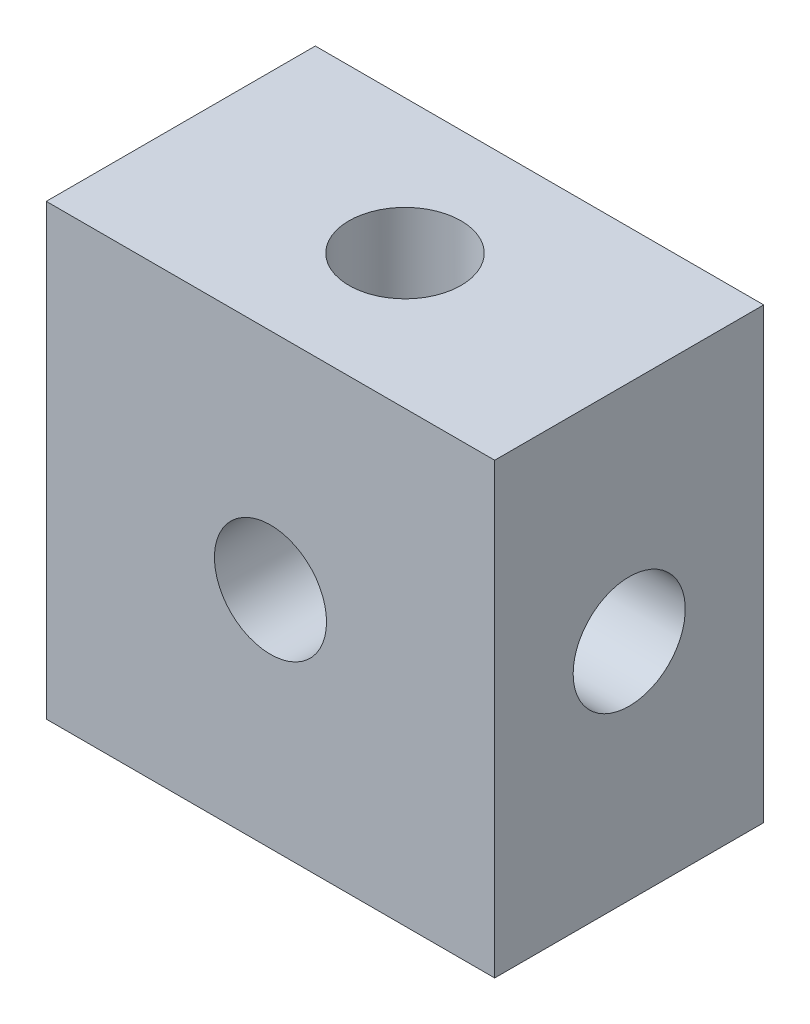
ISO-10303-21;
HEADER;
FILE_DESCRIPTION(('STEP AP214'),'2;1');
FILE_NAME('part.step','',(''),(''),'','','');
FILE_SCHEMA(('AUTOMOTIVE_DESIGN { 1 0 10303 214 1 1 1 1 }'));
ENDSEC;
DATA;
#1=APPLICATION_CONTEXT('core data for automotive mechanical design processes');
#2=APPLICATION_PROTOCOL_DEFINITION('international standard','automotive_design',2000,#1);
#3=PRODUCT_CONTEXT('',#1,'mechanical');
#4=PRODUCT('Part','Part','',(#3));
#5=PRODUCT_RELATED_PRODUCT_CATEGORY('part','',(#4));
#6=PRODUCT_DEFINITION_FORMATION('','',#4);
#7=PRODUCT_DEFINITION_CONTEXT('part definition',#1,'design');
#8=PRODUCT_DEFINITION('design','',#6,#7);
#9=PRODUCT_DEFINITION_SHAPE('','',#8);
#10=(LENGTH_UNIT() NAMED_UNIT(*) SI_UNIT(.MILLI.,.METRE.));
#11=(NAMED_UNIT(*) PLANE_ANGLE_UNIT() SI_UNIT($,.RADIAN.));
#12=(NAMED_UNIT(*) SI_UNIT($,.STERADIAN.) SOLID_ANGLE_UNIT());
#13=UNCERTAINTY_MEASURE_WITH_UNIT(LENGTH_MEASURE(1.E-05),#10,'distance_accuracy_value','');
#14=(GEOMETRIC_REPRESENTATION_CONTEXT(3) GLOBAL_UNCERTAINTY_ASSIGNED_CONTEXT((#13)) GLOBAL_UNIT_ASSIGNED_CONTEXT((#10,
#11,#12)) REPRESENTATION_CONTEXT('',''));
#15=CARTESIAN_POINT('',(0.,0.,0.));
#16=DIRECTION('',(0.,0.,1.));
#17=DIRECTION('',(1.,0.,0.));
#18=AXIS2_PLACEMENT_3D('',#15,#16,#17);
#19=CARTESIAN_POINT('',(-5.,0.,0.));
#20=DIRECTION('',(-1.,0.,0.));
#21=DIRECTION('',(0.,0.,1.));
#22=AXIS2_PLACEMENT_3D('',#19,#20,#21);
#23=CYLINDRICAL_SURFACE('',#22,1.24999999999999);
#24=CARTESIAN_POINT('',(-5.,0.,0.));
#25=DIRECTION('',(-1.,0.,0.));
#26=DIRECTION('',(0.,0.,1.));
#27=AXIS2_PLACEMENT_3D('',#24,#25,#26);
#28=CIRCLE('',#27,1.24999999999999);
#29=CARTESIAN_POINT('',(-5.,0.,1.24999999999999));
#30=VERTEX_POINT('',#29);
#31=EDGE_CURVE('E143',#30,#30,#28,.T.);
#32=ORIENTED_EDGE('',*,*,#31,.T.);
#33=EDGE_LOOP('',(#32));
#34=FACE_BOUND('',#33,.T.);
#35=CARTESIAN_POINT('',(0.,0.,0.));
#36=DIRECTION('',(-0.707106781186547,0.,0.707106781186547));
#37=DIRECTION('',(-0.707106781186547,0.,-0.707106781186547));
#38=AXIS2_PLACEMENT_3D('',#35,#36,#37);
#39=ELLIPSE('',#38,1.76776695296636,1.24999999999999);
#40=CARTESIAN_POINT('',(-0.883883476483179,-0.883883476483179,-0.883883476483179));
#41=VERTEX_POINT('',#40);
#42=CARTESIAN_POINT('',(-0.883883476483179,0.883883476483179,-0.883883476483179));
#43=VERTEX_POINT('',#42);
#44=EDGE_CURVE('E104',#41,#43,#39,.F.);
#45=ORIENTED_EDGE('',*,*,#44,.T.);
#46=CARTESIAN_POINT('',(0.,0.,0.));
#47=DIRECTION('',(-0.707106781186547,-0.707106781186547,0.));
#48=DIRECTION('',(-0.707106781186547,0.707106781186547,0.));
#49=AXIS2_PLACEMENT_3D('',#46,#47,#48);
#50=ELLIPSE('',#49,1.76776695296636,1.24999999999999);
#51=CARTESIAN_POINT('',(-0.883883476483179,0.883883476483179,0.883883476483179));
#52=VERTEX_POINT('',#51);
#53=EDGE_CURVE('E50',#43,#52,#50,.F.);
#54=ORIENTED_EDGE('',*,*,#53,.T.);
#55=CARTESIAN_POINT('',(0.,0.,0.));
#56=DIRECTION('',(-0.707106781186547,0.,-0.707106781186547));
#57=DIRECTION('',(-0.707106781186547,0.,0.707106781186547));
#58=AXIS2_PLACEMENT_3D('',#55,#56,#57);
#59=ELLIPSE('',#58,1.76776695296636,1.24999999999999);
#60=CARTESIAN_POINT('',(-0.883883476483179,-0.883883476483179,0.883883476483179));
#61=VERTEX_POINT('',#60);
#62=EDGE_CURVE('E117',#52,#61,#59,.F.);
#63=ORIENTED_EDGE('',*,*,#62,.T.);
#64=CARTESIAN_POINT('',(0.,0.,0.));
#65=DIRECTION('',(-0.707106781186547,0.707106781186547,0.));
#66=DIRECTION('',(-0.707106781186547,-0.707106781186547,0.));
#67=AXIS2_PLACEMENT_3D('',#64,#65,#66);
#68=ELLIPSE('',#67,1.76776695296636,1.24999999999999);
#69=EDGE_CURVE('E128',#61,#41,#68,.F.);
#70=ORIENTED_EDGE('',*,*,#69,.T.);
#71=EDGE_LOOP('',(#45,#54,#63,#70));
#72=FACE_BOUND('',#71,.T.);
#73=ADVANCED_FACE('F35',(#34,#72),#23,.F.);
#74=CARTESIAN_POINT('',(5.,-5.,3.));
#75=DIRECTION('',(-1.,0.,0.));
#76=DIRECTION('',(0.,0.,1.));
#77=AXIS2_PLACEMENT_3D('',#74,#75,#76);
#78=PLANE('',#77);
#79=CARTESIAN_POINT('',(5.,0.,0.));
#80=DIRECTION('',(-1.,0.,0.));
#81=DIRECTION('',(0.,0.,1.));
#82=AXIS2_PLACEMENT_3D('',#79,#80,#81);
#83=CIRCLE('',#82,1.25);
#84=CARTESIAN_POINT('',(5.,0.,1.25));
#85=VERTEX_POINT('',#84);
#86=EDGE_CURVE('E146',#85,#85,#83,.T.);
#87=ORIENTED_EDGE('',*,*,#86,.T.);
#88=EDGE_LOOP('',(#87));
#89=FACE_BOUND('',#88,.T.);
#90=DIRECTION('',(0.,1.,0.));
#91=VECTOR('',#90,1.);
#92=CARTESIAN_POINT('',(5.,-5.,-3.));
#93=LINE('',#92,#91);
#94=CARTESIAN_POINT('',(5.,-5.,-3.));
#95=VERTEX_POINT('',#94);
#96=CARTESIAN_POINT('',(5.,5.,-3.));
#97=VERTEX_POINT('',#96);
#98=EDGE_CURVE('E149',#95,#97,#93,.T.);
#99=ORIENTED_EDGE('',*,*,#98,.T.);
#100=DIRECTION('',(0.,0.,-1.));
#101=VECTOR('',#100,1.);
#102=CARTESIAN_POINT('',(5.,5.,3.));
#103=LINE('',#102,#101);
#104=CARTESIAN_POINT('',(5.,5.,3.));
#105=VERTEX_POINT('',#104);
#106=EDGE_CURVE('E121',#105,#97,#103,.T.);
#107=ORIENTED_EDGE('',*,*,#106,.F.);
#108=DIRECTION('',(0.,1.,0.));
#109=VECTOR('',#108,1.);
#110=CARTESIAN_POINT('',(5.,-5.,3.));
#111=LINE('',#110,#109);
#112=CARTESIAN_POINT('',(5.,-5.,3.));
#113=VERTEX_POINT('',#112);
#114=EDGE_CURVE('E150',#113,#105,#111,.T.);
#115=ORIENTED_EDGE('',*,*,#114,.F.);
#116=DIRECTION('',(0.,0.,-1.));
#117=VECTOR('',#116,1.);
#118=CARTESIAN_POINT('',(5.,-5.,3.));
#119=LINE('',#118,#117);
#120=EDGE_CURVE('E160',#113,#95,#119,.T.);
#121=ORIENTED_EDGE('',*,*,#120,.T.);
#122=EDGE_LOOP('',(#99,#107,#115,#121));
#123=FACE_BOUND('',#122,.T.);
#124=ADVANCED_FACE('F37',(#89,#123),#78,.F.);
#125=CARTESIAN_POINT('',(-5.,5.,3.));
#126=DIRECTION('',(0.,-1.,0.));
#127=DIRECTION('',(0.,0.,-1.));
#128=AXIS2_PLACEMENT_3D('',#125,#126,#127);
#129=PLANE('',#128);
#130=CARTESIAN_POINT('',(0.,5.,0.));
#131=DIRECTION('',(0.,-1.,0.));
#132=DIRECTION('',(0.,0.,-1.));
#133=AXIS2_PLACEMENT_3D('',#130,#131,#132);
#134=CIRCLE('',#133,1.25);
#135=CARTESIAN_POINT('',(0.,5.,-1.25));
#136=VERTEX_POINT('',#135);
#137=EDGE_CURVE('E114',#136,#136,#134,.T.);
#138=ORIENTED_EDGE('',*,*,#137,.T.);
#139=EDGE_LOOP('',(#138));
#140=FACE_BOUND('',#139,.T.);
#141=DIRECTION('',(-1.,0.,0.));
#142=VECTOR('',#141,1.);
#143=CARTESIAN_POINT('',(-5.,5.,-3.));
#144=LINE('',#143,#142);
#145=CARTESIAN_POINT('',(-5.,5.,-3.));
#146=VERTEX_POINT('',#145);
#147=EDGE_CURVE('E163',#97,#146,#144,.T.);
#148=ORIENTED_EDGE('',*,*,#147,.T.);
#149=DIRECTION('',(0.,0.,-1.));
#150=VECTOR('',#149,1.);
#151=CARTESIAN_POINT('',(-5.,5.,3.));
#152=LINE('',#151,#150);
#153=CARTESIAN_POINT('',(-5.,5.,3.));
#154=VERTEX_POINT('',#153);
#155=EDGE_CURVE('E173',#154,#146,#152,.T.);
#156=ORIENTED_EDGE('',*,*,#155,.F.);
#157=DIRECTION('',(-1.,0.,0.));
#158=VECTOR('',#157,1.);
#159=CARTESIAN_POINT('',(-5.,5.,3.));
#160=LINE('',#159,#158);
#161=EDGE_CURVE('E153',#105,#154,#160,.T.);
#162=ORIENTED_EDGE('',*,*,#161,.F.);
#163=ORIENTED_EDGE('',*,*,#106,.T.);
#164=EDGE_LOOP('',(#148,#156,#162,#163));
#165=FACE_BOUND('',#164,.T.);
#166=ADVANCED_FACE('F178',(#140,#165),#129,.F.);
#167=CARTESIAN_POINT('',(-5.,-5.,3.));
#168=DIRECTION('',(1.,0.,0.));
#169=DIRECTION('',(0.,0.,-1.));
#170=AXIS2_PLACEMENT_3D('',#167,#168,#169);
#171=PLANE('',#170);
#172=ORIENTED_EDGE('',*,*,#31,.F.);
#173=EDGE_LOOP('',(#172));
#174=FACE_BOUND('',#173,.T.);
#175=DIRECTION('',(0.,-1.,0.));
#176=VECTOR('',#175,1.);
#177=CARTESIAN_POINT('',(-5.,-5.,-3.));
#178=LINE('',#177,#176);
#179=CARTESIAN_POINT('',(-5.,-5.,-3.));
#180=VERTEX_POINT('',#179);
#181=EDGE_CURVE('E165',#146,#180,#178,.T.);
#182=ORIENTED_EDGE('',*,*,#181,.T.);
#183=DIRECTION('',(0.,0.,-1.));
#184=VECTOR('',#183,1.);
#185=CARTESIAN_POINT('',(-5.,-5.,3.));
#186=LINE('',#185,#184);
#187=CARTESIAN_POINT('',(-5.,-5.,3.));
#188=VERTEX_POINT('',#187);
#189=EDGE_CURVE('E170',#188,#180,#186,.T.);
#190=ORIENTED_EDGE('',*,*,#189,.F.);
#191=DIRECTION('',(0.,-1.,0.));
#192=VECTOR('',#191,1.);
#193=CARTESIAN_POINT('',(-5.,-5.,3.));
#194=LINE('',#193,#192);
#195=EDGE_CURVE('E156',#154,#188,#194,.T.);
#196=ORIENTED_EDGE('',*,*,#195,.F.);
#197=ORIENTED_EDGE('',*,*,#155,.T.);
#198=EDGE_LOOP('',(#182,#190,#196,#197));
#199=FACE_BOUND('',#198,.T.);
#200=ADVANCED_FACE('F190',(#174,#199),#171,.F.);
#201=CARTESIAN_POINT('',(-5.,-5.,3.));
#202=DIRECTION('',(0.,1.,0.));
#203=DIRECTION('',(0.,0.,1.));
#204=AXIS2_PLACEMENT_3D('',#201,#202,#203);
#205=PLANE('',#204);
#206=CARTESIAN_POINT('',(0.,-5.,0.));
#207=DIRECTION('',(0.,-1.,0.));
#208=DIRECTION('',(0.,0.,-1.));
#209=AXIS2_PLACEMENT_3D('',#206,#207,#208);
#210=CIRCLE('',#209,1.24999999999999);
#211=CARTESIAN_POINT('',(0.,-5.,-1.24999999999999));
#212=VERTEX_POINT('',#211);
#213=EDGE_CURVE('E238',#212,#212,#210,.T.);
#214=ORIENTED_EDGE('',*,*,#213,.F.);
#215=EDGE_LOOP('',(#214));
#216=FACE_BOUND('',#215,.T.);
#217=DIRECTION('',(1.,0.,0.));
#218=VECTOR('',#217,1.);
#219=CARTESIAN_POINT('',(-5.,-5.,-3.));
#220=LINE('',#219,#218);
#221=EDGE_CURVE('E154',#180,#95,#220,.T.);
#222=ORIENTED_EDGE('',*,*,#221,.T.);
#223=ORIENTED_EDGE('',*,*,#120,.F.);
#224=DIRECTION('',(1.,0.,0.));
#225=VECTOR('',#224,1.);
#226=CARTESIAN_POINT('',(-5.,-5.,3.));
#227=LINE('',#226,#225);
#228=EDGE_CURVE('E158',#188,#113,#227,.T.);
#229=ORIENTED_EDGE('',*,*,#228,.F.);
#230=ORIENTED_EDGE('',*,*,#189,.T.);
#231=EDGE_LOOP('',(#222,#223,#229,#230));
#232=FACE_BOUND('',#231,.T.);
#233=ADVANCED_FACE('F194',(#216,#232),#205,.F.);
#234=CARTESIAN_POINT('',(0.,0.,3.));
#235=DIRECTION('',(0.,0.,-1.));
#236=DIRECTION('',(-1.,0.,0.));
#237=AXIS2_PLACEMENT_3D('',#234,#235,#236);
#238=PLANE('',#237);
#239=CARTESIAN_POINT('',(0.,0.,3.));
#240=DIRECTION('',(0.,0.,1.));
#241=DIRECTION('',(1.,0.,0.));
#242=AXIS2_PLACEMENT_3D('',#239,#240,#241);
#243=CIRCLE('',#242,1.24999999999999);
#244=CARTESIAN_POINT('',(1.24999999999999,0.,3.));
#245=VERTEX_POINT('',#244);
#246=EDGE_CURVE('E137',#245,#245,#243,.T.);
#247=ORIENTED_EDGE('',*,*,#246,.F.);
#248=EDGE_LOOP('',(#247));
#249=FACE_BOUND('',#248,.T.);
#250=ORIENTED_EDGE('',*,*,#114,.T.);
#251=ORIENTED_EDGE('',*,*,#161,.T.);
#252=ORIENTED_EDGE('',*,*,#195,.T.);
#253=ORIENTED_EDGE('',*,*,#228,.T.);
#254=EDGE_LOOP('',(#250,#251,#252,#253));
#255=FACE_BOUND('',#254,.T.);
#256=ADVANCED_FACE('F196',(#249,#255),#238,.F.);
#257=CARTESIAN_POINT('',(0.,0.,-3.));
#258=DIRECTION('',(0.,0.,-1.));
#259=DIRECTION('',(-1.,0.,0.));
#260=AXIS2_PLACEMENT_3D('',#257,#258,#259);
#261=PLANE('',#260);
#262=CARTESIAN_POINT('',(0.,0.,-3.));
#263=DIRECTION('',(0.,0.,1.));
#264=DIRECTION('',(1.,0.,0.));
#265=AXIS2_PLACEMENT_3D('',#262,#263,#264);
#266=CIRCLE('',#265,1.25);
#267=CARTESIAN_POINT('',(1.25,0.,-3.));
#268=VERTEX_POINT('',#267);
#269=EDGE_CURVE('E140',#268,#268,#266,.T.);
#270=ORIENTED_EDGE('',*,*,#269,.T.);
#271=EDGE_LOOP('',(#270));
#272=FACE_BOUND('',#271,.T.);
#273=ORIENTED_EDGE('',*,*,#98,.F.);
#274=ORIENTED_EDGE('',*,*,#221,.F.);
#275=ORIENTED_EDGE('',*,*,#181,.F.);
#276=ORIENTED_EDGE('',*,*,#147,.F.);
#277=EDGE_LOOP('',(#273,#274,#275,#276));
#278=FACE_BOUND('',#277,.T.);
#279=ADVANCED_FACE('F186',(#272,#278),#261,.T.);
#280=CARTESIAN_POINT('',(0.,0.,0.));
#281=DIRECTION('',(-0.707106781186547,0.,-0.707106781186547));
#282=DIRECTION('',(-0.707106781186547,0.,0.707106781186547));
#283=AXIS2_PLACEMENT_3D('',#280,#281,#282);
#284=ELLIPSE('',#283,1.76776695296636,1.24999999999999);
#285=CARTESIAN_POINT('',(0.883883476483179,0.883883476483179,-0.883883476483179));
#286=VERTEX_POINT('',#285);
#287=CARTESIAN_POINT('',(0.883883476483179,-0.883883476483179,-0.883883476483179));
#288=VERTEX_POINT('',#287);
#289=EDGE_CURVE('E110',#286,#288,#284,.T.);
#290=ORIENTED_EDGE('',*,*,#289,.T.);
#291=CARTESIAN_POINT('',(0.,0.,0.));
#292=DIRECTION('',(-0.707106781186547,-0.707106781186547,0.));
#293=DIRECTION('',(-0.707106781186547,0.707106781186547,0.));
#294=AXIS2_PLACEMENT_3D('',#291,#292,#293);
#295=ELLIPSE('',#294,1.76776695296636,1.24999999999999);
#296=CARTESIAN_POINT('',(0.883883476483179,-0.883883476483179,0.883883476483179));
#297=VERTEX_POINT('',#296);
#298=EDGE_CURVE('E58',#288,#297,#295,.T.);
#299=ORIENTED_EDGE('',*,*,#298,.T.);
#300=CARTESIAN_POINT('',(0.,0.,0.));
#301=DIRECTION('',(-0.707106781186547,0.,0.707106781186547));
#302=DIRECTION('',(-0.707106781186547,0.,-0.707106781186547));
#303=AXIS2_PLACEMENT_3D('',#300,#301,#302);
#304=ELLIPSE('',#303,1.76776695296636,1.24999999999999);
#305=CARTESIAN_POINT('',(0.883883476483179,0.883883476483179,0.883883476483179));
#306=VERTEX_POINT('',#305);
#307=EDGE_CURVE('E112',#297,#306,#304,.T.);
#308=ORIENTED_EDGE('',*,*,#307,.T.);
#309=CARTESIAN_POINT('',(0.,0.,0.));
#310=DIRECTION('',(-0.707106781186547,0.707106781186547,0.));
#311=DIRECTION('',(-0.707106781186547,-0.707106781186547,0.));
#312=AXIS2_PLACEMENT_3D('',#309,#310,#311);
#313=ELLIPSE('',#312,1.76776695296636,1.24999999999999);
#314=EDGE_CURVE('E98',#306,#286,#313,.T.);
#315=ORIENTED_EDGE('',*,*,#314,.T.);
#316=EDGE_LOOP('',(#290,#299,#308,#315));
#317=FACE_BOUND('',#316,.T.);
#318=ORIENTED_EDGE('',*,*,#86,.F.);
#319=EDGE_LOOP('',(#318));
#320=FACE_BOUND('',#319,.T.);
#321=ADVANCED_FACE('F108',(#317,#320),#23,.F.);
#322=CARTESIAN_POINT('',(0.,0.,3.));
#323=DIRECTION('',(0.,0.,1.));
#324=DIRECTION('',(1.,0.,0.));
#325=AXIS2_PLACEMENT_3D('',#322,#323,#324);
#326=CYLINDRICAL_SURFACE('',#325,1.24999999999999);
#327=ORIENTED_EDGE('',*,*,#246,.T.);
#328=EDGE_LOOP('',(#327));
#329=FACE_BOUND('',#328,.T.);
#330=ORIENTED_EDGE('',*,*,#62,.F.);
#331=CARTESIAN_POINT('',(0.,0.,0.));
#332=DIRECTION('',(0.,-0.707106781186547,0.707106781186547));
#333=DIRECTION('',(0.,0.707106781186547,0.707106781186547));
#334=AXIS2_PLACEMENT_3D('',#331,#332,#333);
#335=ELLIPSE('',#334,1.76776695296636,1.24999999999999);
#336=EDGE_CURVE('E113',#52,#306,#335,.F.);
#337=ORIENTED_EDGE('',*,*,#336,.T.);
#338=ORIENTED_EDGE('',*,*,#307,.F.);
#339=CARTESIAN_POINT('',(0.,0.,0.));
#340=DIRECTION('',(0.,0.707106781186547,0.707106781186547));
#341=DIRECTION('',(0.,-0.707106781186547,0.707106781186547));
#342=AXIS2_PLACEMENT_3D('',#339,#340,#341);
#343=ELLIPSE('',#342,1.76776695296636,1.24999999999999);
#344=EDGE_CURVE('E131',#297,#61,#343,.F.);
#345=ORIENTED_EDGE('',*,*,#344,.T.);
#346=EDGE_LOOP('',(#330,#337,#338,#345));
#347=FACE_BOUND('',#346,.T.);
#348=ADVANCED_FACE('F218',(#329,#347),#326,.F.);
#349=ORIENTED_EDGE('',*,*,#269,.F.);
#350=EDGE_LOOP('',(#349));
#351=FACE_BOUND('',#350,.T.);
#352=ORIENTED_EDGE('',*,*,#44,.F.);
#353=CARTESIAN_POINT('',(0.,0.,0.));
#354=DIRECTION('',(0.,-0.707106781186547,0.707106781186547));
#355=DIRECTION('',(0.,0.707106781186547,0.707106781186547));
#356=AXIS2_PLACEMENT_3D('',#353,#354,#355);
#357=ELLIPSE('',#356,1.76776695296636,1.24999999999999);
#358=EDGE_CURVE('E11',#41,#288,#357,.T.);
#359=ORIENTED_EDGE('',*,*,#358,.T.);
#360=ORIENTED_EDGE('',*,*,#289,.F.);
#361=CARTESIAN_POINT('',(0.,0.,0.));
#362=DIRECTION('',(0.,0.707106781186547,0.707106781186547));
#363=DIRECTION('',(0.,-0.707106781186547,0.707106781186547));
#364=AXIS2_PLACEMENT_3D('',#361,#362,#363);
#365=ELLIPSE('',#364,1.76776695296636,1.24999999999999);
#366=EDGE_CURVE('E43',#286,#43,#365,.T.);
#367=ORIENTED_EDGE('',*,*,#366,.T.);
#368=EDGE_LOOP('',(#352,#359,#360,#367));
#369=FACE_BOUND('',#368,.T.);
#370=ADVANCED_FACE('F116',(#351,#369),#326,.F.);
#371=CARTESIAN_POINT('',(0.,-5.,0.));
#372=DIRECTION('',(0.,-1.,0.));
#373=DIRECTION('',(0.,0.,-1.));
#374=AXIS2_PLACEMENT_3D('',#371,#372,#373);
#375=CYLINDRICAL_SURFACE('',#374,1.24999999999999);
#376=ORIENTED_EDGE('',*,*,#137,.F.);
#377=EDGE_LOOP('',(#376));
#378=FACE_BOUND('',#377,.T.);
#379=ORIENTED_EDGE('',*,*,#366,.F.);
#380=ORIENTED_EDGE('',*,*,#314,.F.);
#381=ORIENTED_EDGE('',*,*,#336,.F.);
#382=ORIENTED_EDGE('',*,*,#53,.F.);
#383=EDGE_LOOP('',(#379,#380,#381,#382));
#384=FACE_BOUND('',#383,.T.);
#385=ADVANCED_FACE('F97',(#378,#384),#375,.F.);
#386=ORIENTED_EDGE('',*,*,#213,.T.);
#387=EDGE_LOOP('',(#386));
#388=FACE_BOUND('',#387,.T.);
#389=ORIENTED_EDGE('',*,*,#298,.F.);
#390=ORIENTED_EDGE('',*,*,#358,.F.);
#391=ORIENTED_EDGE('',*,*,#69,.F.);
#392=ORIENTED_EDGE('',*,*,#344,.F.);
#393=EDGE_LOOP('',(#389,#390,#391,#392));
#394=FACE_BOUND('',#393,.T.);
#395=ADVANCED_FACE('F229',(#388,#394),#375,.F.);
#396=CLOSED_SHELL('',(#73,#124,#166,#200,#233,#256,#279,#321,#348,#370,#385,#395));
#397=MANIFOLD_SOLID_BREP('B2',#396);
#398=ADVANCED_BREP_SHAPE_REPRESENTATION('',(#18,#397),#14);
#399=SHAPE_DEFINITION_REPRESENTATION(#9,#398);
ENDSEC;
END-ISO-10303-21;
